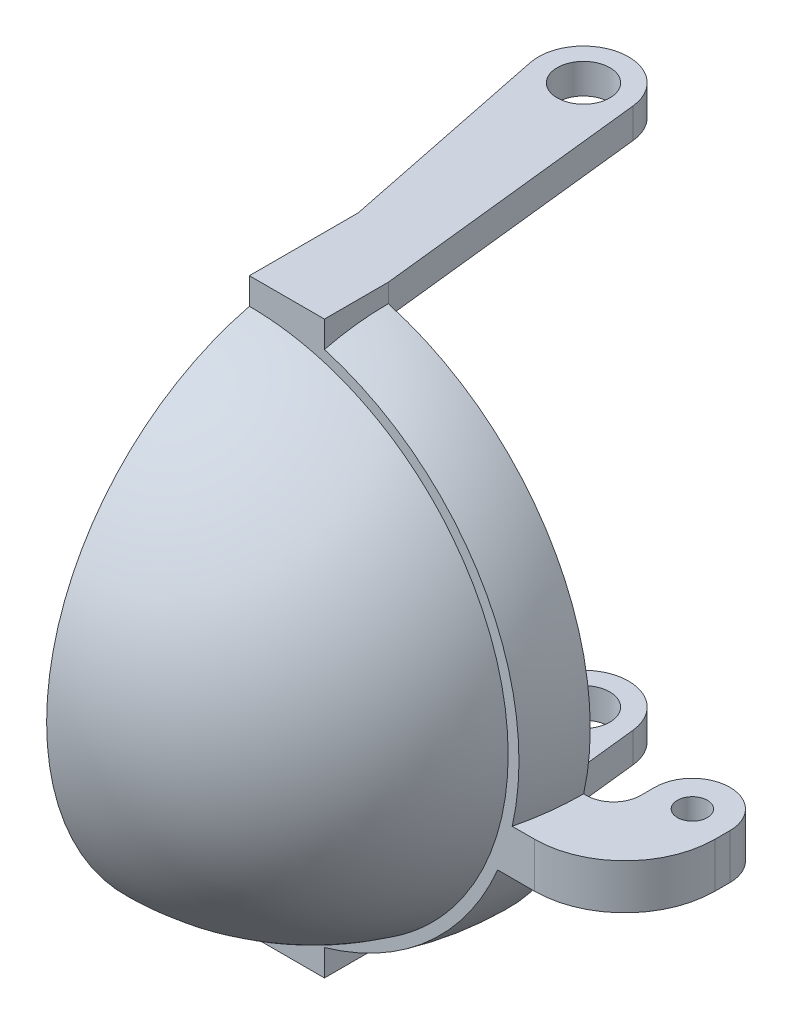
ISO-10303-21;
HEADER;
FILE_DESCRIPTION(('STEP AP214'),'2;1');
FILE_NAME('part.step','',(''),(''),'','','');
FILE_SCHEMA(('AUTOMOTIVE_DESIGN { 1 0 10303 214 1 1 1 1 }'));
ENDSEC;
DATA;
#1=APPLICATION_CONTEXT('core data for automotive mechanical design processes');
#2=APPLICATION_PROTOCOL_DEFINITION('international standard','automotive_design',2000,#1);
#3=PRODUCT_CONTEXT('',#1,'mechanical');
#4=PRODUCT('Part','Part','',(#3));
#5=PRODUCT_RELATED_PRODUCT_CATEGORY('part','',(#4));
#6=PRODUCT_DEFINITION_FORMATION('','',#4);
#7=PRODUCT_DEFINITION_CONTEXT('part definition',#1,'design');
#8=PRODUCT_DEFINITION('design','',#6,#7);
#9=PRODUCT_DEFINITION_SHAPE('','',#8);
#10=(LENGTH_UNIT() NAMED_UNIT(*) SI_UNIT(.MILLI.,.METRE.));
#11=(NAMED_UNIT(*) PLANE_ANGLE_UNIT() SI_UNIT($,.RADIAN.));
#12=(NAMED_UNIT(*) SI_UNIT($,.STERADIAN.) SOLID_ANGLE_UNIT());
#13=UNCERTAINTY_MEASURE_WITH_UNIT(LENGTH_MEASURE(1.E-05),#10,'distance_accuracy_value','');
#14=(GEOMETRIC_REPRESENTATION_CONTEXT(3) GLOBAL_UNCERTAINTY_ASSIGNED_CONTEXT((#13)) GLOBAL_UNIT_ASSIGNED_CONTEXT((#10,
#11,#12)) REPRESENTATION_CONTEXT('',''));
#15=CARTESIAN_POINT('',(0.,0.,0.));
#16=DIRECTION('',(0.,0.,1.));
#17=DIRECTION('',(1.,0.,0.));
#18=AXIS2_PLACEMENT_3D('',#15,#16,#17);
#19=CARTESIAN_POINT('',(0.,0.,0.));
#20=DIRECTION('',(0.,0.,-1.));
#21=DIRECTION('',(0.,-1.,0.));
#22=AXIS2_PLACEMENT_3D('',#19,#20,#21);
#23=SPHERICAL_SURFACE('',#22,18.45);
#24=CARTESIAN_POINT('',(0.,0.,4.25));
#25=DIRECTION('',(0.,0.,1.));
#26=DIRECTION('',(1.,0.,0.));
#27=AXIS2_PLACEMENT_3D('',#24,#25,#26);
#28=CIRCLE('',#27,17.9538296750303);
#29=CARTESIAN_POINT('',(5.,-17.2435495185881,4.25));
#30=VERTEX_POINT('',#29);
#31=CARTESIAN_POINT('',(16.5329973084133,-7.,4.25));
#32=VERTEX_POINT('',#31);
#33=EDGE_CURVE('E359',#30,#32,#28,.T.);
#34=ORIENTED_EDGE('',*,*,#33,.F.);
#35=CARTESIAN_POINT('',(5.,0.,0.));
#36=DIRECTION('',(1.,0.,0.));
#37=DIRECTION('',(0.,0.,-1.));
#38=AXIS2_PLACEMENT_3D('',#35,#36,#37);
#39=CIRCLE('',#38,17.7595748822994);
#40=CARTESIAN_POINT('',(5.,-17.7595748822994,0.));
#41=VERTEX_POINT('',#40);
#42=EDGE_CURVE('E339',#41,#30,#39,.F.);
#43=ORIENTED_EDGE('',*,*,#42,.F.);
#44=CARTESIAN_POINT('',(0.,0.,0.));
#45=DIRECTION('',(0.,0.,1.));
#46=DIRECTION('',(1.,0.,0.));
#47=AXIS2_PLACEMENT_3D('',#44,#45,#46);
#48=CIRCLE('',#47,18.45);
#49=CARTESIAN_POINT('',(17.0705155165273,-7.,0.));
#50=VERTEX_POINT('',#49);
#51=EDGE_CURVE('E366',#41,#50,#48,.T.);
#52=ORIENTED_EDGE('',*,*,#51,.T.);
#53=CARTESIAN_POINT('',(0.,-7.,0.));
#54=DIRECTION('',(0.,1.,0.));
#55=DIRECTION('',(0.,0.,1.));
#56=AXIS2_PLACEMENT_3D('',#53,#54,#55);
#57=CIRCLE('',#56,17.0705155165273);
#58=EDGE_CURVE('E235',#50,#32,#57,.F.);
#59=ORIENTED_EDGE('',*,*,#58,.T.);
#60=EDGE_LOOP('',(#34,#43,#52,#59));
#61=FACE_BOUND('',#60,.T.);
#62=ADVANCED_FACE('F45',(#61),#23,.T.);
#63=CARTESIAN_POINT('',(0.,0.,0.));
#64=DIRECTION('',(0.,0.,-1.));
#65=DIRECTION('',(1.,0.,0.));
#66=AXIS2_PLACEMENT_3D('',#63,#64,#65);
#67=PLANE('',#66);
#68=DIRECTION('',(1.,0.,0.));
#69=VECTOR('',#68,1.);
#70=CARTESIAN_POINT('',(-18.451,-7.,0.));
#71=LINE('',#70,#69);
#72=CARTESIAN_POINT('',(18.2,-7.,0.));
#73=VERTEX_POINT('',#72);
#74=EDGE_CURVE('E230',#50,#73,#71,.T.);
#75=ORIENTED_EDGE('',*,*,#74,.F.);
#76=ORIENTED_EDGE('',*,*,#51,.F.);
#77=DIRECTION('',(0.,-1.,0.));
#78=VECTOR('',#77,1.);
#79=CARTESIAN_POINT('',(5.,-17.,0.));
#80=LINE('',#79,#78);
#81=CARTESIAN_POINT('',(5.,-17.,0.));
#82=VERTEX_POINT('',#81);
#83=EDGE_CURVE('E330',#82,#41,#80,.T.);
#84=ORIENTED_EDGE('',*,*,#83,.F.);
#85=DIRECTION('',(1.,0.,0.));
#86=VECTOR('',#85,1.);
#87=CARTESIAN_POINT('',(5.,-17.,0.));
#88=LINE('',#87,#86);
#89=CARTESIAN_POINT('',(0.,-17.,0.));
#90=VERTEX_POINT('',#89);
#91=EDGE_CURVE('E315',#90,#82,#88,.T.);
#92=ORIENTED_EDGE('',*,*,#91,.F.);
#93=CARTESIAN_POINT('',(0.,0.,0.));
#94=DIRECTION('',(0.,0.,-1.));
#95=DIRECTION('',(1.,0.,0.));
#96=AXIS2_PLACEMENT_3D('',#93,#94,#95);
#97=CIRCLE('',#96,17.);
#98=CARTESIAN_POINT('',(0.,17.,0.));
#99=VERTEX_POINT('',#98);
#100=EDGE_CURVE('E375',#99,#90,#97,.T.);
#101=ORIENTED_EDGE('',*,*,#100,.F.);
#102=DIRECTION('',(1.,0.,0.));
#103=VECTOR('',#102,1.);
#104=CARTESIAN_POINT('',(5.,17.,0.));
#105=LINE('',#104,#103);
#106=CARTESIAN_POINT('',(5.,17.,0.));
#107=VERTEX_POINT('',#106);
#108=EDGE_CURVE('E262',#99,#107,#105,.T.);
#109=ORIENTED_EDGE('',*,*,#108,.T.);
#110=DIRECTION('',(0.,1.,0.));
#111=VECTOR('',#110,1.);
#112=CARTESIAN_POINT('',(5.,17.,0.));
#113=LINE('',#112,#111);
#114=CARTESIAN_POINT('',(5.,17.7595748822994,0.));
#115=VERTEX_POINT('',#114);
#116=EDGE_CURVE('E282',#107,#115,#113,.T.);
#117=ORIENTED_EDGE('',*,*,#116,.T.);
#118=CARTESIAN_POINT('',(18.0111770853545,-4.,0.));
#119=VERTEX_POINT('',#118);
#120=EDGE_CURVE('E365',#119,#115,#48,.T.);
#121=ORIENTED_EDGE('',*,*,#120,.F.);
#122=DIRECTION('',(1.,0.,0.));
#123=VECTOR('',#122,1.);
#124=CARTESIAN_POINT('',(-18.451,-4.,0.));
#125=LINE('',#124,#123);
#126=CARTESIAN_POINT('',(18.2,-4.,0.));
#127=VERTEX_POINT('',#126);
#128=EDGE_CURVE('E236',#119,#127,#125,.T.);
#129=ORIENTED_EDGE('',*,*,#128,.T.);
#130=DIRECTION('',(0.,-1.,0.));
#131=VECTOR('',#130,1.);
#132=CARTESIAN_POINT('',(18.2,0.,0.));
#133=LINE('',#132,#131);
#134=EDGE_CURVE('E389',#73,#127,#133,.F.);
#135=ORIENTED_EDGE('',*,*,#134,.F.);
#136=EDGE_LOOP('',(#75,#76,#84,#92,#101,#109,#117,#121,#129,#135));
#137=FACE_BOUND('',#136,.T.);
#138=ADVANCED_FACE('F392',(#137),#67,.T.);
#139=ORIENTED_EDGE('',*,*,#120,.T.);
#140=CARTESIAN_POINT('',(5.,0.,0.));
#141=DIRECTION('',(-1.,0.,0.));
#142=DIRECTION('',(0.,0.,1.));
#143=AXIS2_PLACEMENT_3D('',#140,#141,#142);
#144=CIRCLE('',#143,17.7595748822994);
#145=CARTESIAN_POINT('',(5.,17.2435495185881,4.25));
#146=VERTEX_POINT('',#145);
#147=EDGE_CURVE('E286',#115,#146,#144,.F.);
#148=ORIENTED_EDGE('',*,*,#147,.T.);
#149=CARTESIAN_POINT('',(17.5025712396779,-4.,4.25));
#150=VERTEX_POINT('',#149);
#151=EDGE_CURVE('E358',#150,#146,#28,.T.);
#152=ORIENTED_EDGE('',*,*,#151,.F.);
#153=CARTESIAN_POINT('',(0.,-4.,0.));
#154=DIRECTION('',(0.,-1.,0.));
#155=DIRECTION('',(0.,0.,-1.));
#156=AXIS2_PLACEMENT_3D('',#153,#154,#155);
#157=CIRCLE('',#156,18.0111770853545);
#158=EDGE_CURVE('E232',#150,#119,#157,.F.);
#159=ORIENTED_EDGE('',*,*,#158,.T.);
#160=EDGE_LOOP('',(#139,#148,#152,#159));
#161=FACE_BOUND('',#160,.T.);
#162=ADVANCED_FACE('F398',(#161),#23,.T.);
#163=CARTESIAN_POINT('',(0.,0.,0.));
#164=DIRECTION('',(0.,1.,0.));
#165=DIRECTION('',(-1.,0.,0.));
#166=AXIS2_PLACEMENT_3D('',#163,#164,#165);
#167=SPHERICAL_SURFACE('',#166,17.75);
#168=CARTESIAN_POINT('',(0.,0.,4.25));
#169=DIRECTION('',(0.,0.,1.));
#170=DIRECTION('',(1.,0.,0.));
#171=AXIS2_PLACEMENT_3D('',#168,#169,#170);
#172=CIRCLE('',#171,17.2336879396141);
#173=CARTESIAN_POINT('',(-1.20342199681217E-13,-17.2336879396141,4.25));
#174=VERTEX_POINT('',#173);
#175=CARTESIAN_POINT('',(0.,17.2336879396141,4.25));
#176=VERTEX_POINT('',#175);
#177=EDGE_CURVE('E362',#174,#176,#172,.T.);
#178=ORIENTED_EDGE('',*,*,#177,.T.);
#179=CARTESIAN_POINT('',(0.,0.,0.));
#180=DIRECTION('',(-1.,0.,0.));
#181=DIRECTION('',(0.,0.,1.));
#182=AXIS2_PLACEMENT_3D('',#179,#180,#181);
#183=CIRCLE('',#182,17.75);
#184=EDGE_CURVE('E372',#174,#176,#183,.T.);
#185=ORIENTED_EDGE('',*,*,#184,.F.);
#186=EDGE_LOOP('',(#178,#185));
#187=FACE_BOUND('',#186,.T.);
#188=ADVANCED_FACE('F459',(#187),#167,.T.);
#189=CARTESIAN_POINT('',(0.,0.,0.));
#190=DIRECTION('',(0.,1.,0.));
#191=DIRECTION('',(1.,0.,0.));
#192=AXIS2_PLACEMENT_3D('',#189,#190,#191);
#193=SPHERICAL_SURFACE('',#192,17.);
#194=CARTESIAN_POINT('',(0.,0.,0.));
#195=DIRECTION('',(1.,0.,0.));
#196=DIRECTION('',(0.,0.,1.));
#197=AXIS2_PLACEMENT_3D('',#194,#195,#196);
#198=CIRCLE('',#197,17.);
#199=EDGE_CURVE('E369',#99,#90,#198,.T.);
#200=ORIENTED_EDGE('',*,*,#199,.F.);
#201=ORIENTED_EDGE('',*,*,#100,.T.);
#202=EDGE_LOOP('',(#200,#201));
#203=FACE_BOUND('',#202,.T.);
#204=ADVANCED_FACE('F433',(#203),#193,.F.);
#205=CARTESIAN_POINT('',(0.,0.,0.));
#206=DIRECTION('',(1.,0.,0.));
#207=DIRECTION('',(0.,0.,1.));
#208=AXIS2_PLACEMENT_3D('',#205,#206,#207);
#209=PLANE('',#208);
#210=ORIENTED_EDGE('',*,*,#199,.T.);
#211=DIRECTION('',(0.,0.,1.));
#212=VECTOR('',#211,1.);
#213=CARTESIAN_POINT('',(0.,-17.,0.));
#214=LINE('',#213,#212);
#215=CARTESIAN_POINT('',(0.,-17.,-3.));
#216=VERTEX_POINT('',#215);
#217=EDGE_CURVE('E313',#216,#90,#214,.T.);
#218=ORIENTED_EDGE('',*,*,#217,.F.);
#219=DIRECTION('',(0.,-1.,0.));
#220=VECTOR('',#219,1.);
#221=CARTESIAN_POINT('',(0.,-17.,-3.));
#222=LINE('',#221,#220);
#223=CARTESIAN_POINT('',(0.,-19.,-3.));
#224=VERTEX_POINT('',#223);
#225=EDGE_CURVE('E333',#216,#224,#222,.T.);
#226=ORIENTED_EDGE('',*,*,#225,.T.);
#227=DIRECTION('',(0.,0.,-1.));
#228=VECTOR('',#227,1.);
#229=CARTESIAN_POINT('',(0.,-19.,0.));
#230=LINE('',#229,#228);
#231=CARTESIAN_POINT('',(0.,-19.,4.25));
#232=VERTEX_POINT('',#231);
#233=EDGE_CURVE('E329',#232,#224,#230,.T.);
#234=ORIENTED_EDGE('',*,*,#233,.F.);
#235=DIRECTION('',(0.,-1.,0.));
#236=VECTOR('',#235,1.);
#237=CARTESIAN_POINT('',(-1.25370922542273E-13,-17.9538296750303,4.25));
#238=LINE('',#237,#236);
#239=EDGE_CURVE('E355',#174,#232,#238,.T.);
#240=ORIENTED_EDGE('',*,*,#239,.F.);
#241=ORIENTED_EDGE('',*,*,#184,.T.);
#242=DIRECTION('',(0.,1.,0.));
#243=VECTOR('',#242,1.);
#244=CARTESIAN_POINT('',(0.,17.9538296750303,4.25));
#245=LINE('',#244,#243);
#246=CARTESIAN_POINT('',(0.,19.,4.25));
#247=VERTEX_POINT('',#246);
#248=EDGE_CURVE('E348',#176,#247,#245,.T.);
#249=ORIENTED_EDGE('',*,*,#248,.T.);
#250=DIRECTION('',(0.,0.,-1.));
#251=VECTOR('',#250,1.);
#252=CARTESIAN_POINT('',(0.,19.,0.));
#253=LINE('',#252,#251);
#254=CARTESIAN_POINT('',(0.,19.,-3.));
#255=VERTEX_POINT('',#254);
#256=EDGE_CURVE('E278',#247,#255,#253,.T.);
#257=ORIENTED_EDGE('',*,*,#256,.T.);
#258=DIRECTION('',(0.,1.,0.));
#259=VECTOR('',#258,1.);
#260=CARTESIAN_POINT('',(0.,17.,-3.));
#261=LINE('',#260,#259);
#262=CARTESIAN_POINT('',(0.,17.,-3.));
#263=VERTEX_POINT('',#262);
#264=EDGE_CURVE('E279',#263,#255,#261,.T.);
#265=ORIENTED_EDGE('',*,*,#264,.F.);
#266=DIRECTION('',(0.,0.,1.));
#267=VECTOR('',#266,1.);
#268=CARTESIAN_POINT('',(0.,17.,0.));
#269=LINE('',#268,#267);
#270=EDGE_CURVE('E265',#263,#99,#269,.T.);
#271=ORIENTED_EDGE('',*,*,#270,.T.);
#272=EDGE_LOOP('',(#210,#218,#226,#234,#240,#241,#249,#257,#265,#271));
#273=FACE_BOUND('',#272,.T.);
#274=ADVANCED_FACE('F456',(#273),#209,.F.);
#275=CARTESIAN_POINT('',(-1.25370922542273E-13,-17.9538296750303,4.25));
#276=DIRECTION('',(0.,0.,-1.));
#277=DIRECTION('',(1.,0.,0.));
#278=AXIS2_PLACEMENT_3D('',#275,#276,#277);
#279=PLANE('',#278);
#280=DIRECTION('',(1.,0.,0.));
#281=VECTOR('',#280,1.);
#282=CARTESIAN_POINT('',(-18.451,-4.,4.25));
#283=LINE('',#282,#281);
#284=CARTESIAN_POINT('',(19.,-4.,4.25));
#285=VERTEX_POINT('',#284);
#286=EDGE_CURVE('E239',#150,#285,#283,.T.);
#287=ORIENTED_EDGE('',*,*,#286,.F.);
#288=ORIENTED_EDGE('',*,*,#151,.T.);
#289=DIRECTION('',(0.,1.,0.));
#290=VECTOR('',#289,1.);
#291=CARTESIAN_POINT('',(5.,-19.001,4.25));
#292=LINE('',#291,#290);
#293=CARTESIAN_POINT('',(5.,19.,4.25));
#294=VERTEX_POINT('',#293);
#295=EDGE_CURVE('E290',#146,#294,#292,.T.);
#296=ORIENTED_EDGE('',*,*,#295,.T.);
#297=DIRECTION('',(-1.,0.,0.));
#298=VECTOR('',#297,1.);
#299=CARTESIAN_POINT('',(0.,19.,4.25));
#300=LINE('',#299,#298);
#301=EDGE_CURVE('E293',#294,#247,#300,.T.);
#302=ORIENTED_EDGE('',*,*,#301,.T.);
#303=ORIENTED_EDGE('',*,*,#248,.F.);
#304=ORIENTED_EDGE('',*,*,#177,.F.);
#305=ORIENTED_EDGE('',*,*,#239,.T.);
#306=DIRECTION('',(-1.,0.,0.));
#307=VECTOR('',#306,1.);
#308=CARTESIAN_POINT('',(0.,-19.,4.25));
#309=LINE('',#308,#307);
#310=CARTESIAN_POINT('',(5.,-19.,4.25));
#311=VERTEX_POINT('',#310);
#312=EDGE_CURVE('E337',#311,#232,#309,.T.);
#313=ORIENTED_EDGE('',*,*,#312,.F.);
#314=DIRECTION('',(0.,-1.,0.));
#315=VECTOR('',#314,1.);
#316=CARTESIAN_POINT('',(5.,18.451,4.25));
#317=LINE('',#316,#315);
#318=EDGE_CURVE('E340',#30,#311,#317,.T.);
#319=ORIENTED_EDGE('',*,*,#318,.F.);
#320=ORIENTED_EDGE('',*,*,#33,.T.);
#321=DIRECTION('',(1.,0.,0.));
#322=VECTOR('',#321,1.);
#323=CARTESIAN_POINT('',(-18.451,-7.,4.25));
#324=LINE('',#323,#322);
#325=CARTESIAN_POINT('',(19.,-7.,4.25));
#326=VERTEX_POINT('',#325);
#327=EDGE_CURVE('E242',#32,#326,#324,.T.);
#328=ORIENTED_EDGE('',*,*,#327,.T.);
#329=DIRECTION('',(0.,-1.,0.));
#330=VECTOR('',#329,1.);
#331=CARTESIAN_POINT('',(19.,-17.9538296750303,4.25));
#332=LINE('',#331,#330);
#333=EDGE_CURVE('E378',#285,#326,#332,.T.);
#334=ORIENTED_EDGE('',*,*,#333,.F.);
#335=EDGE_LOOP('',(#287,#288,#296,#302,#303,#304,#305,#313,#319,#320,#328,#334));
#336=FACE_BOUND('',#335,.T.);
#337=ADVANCED_FACE('F401',(#336),#279,.F.);
#338=CARTESIAN_POINT('',(5.,18.451,0.));
#339=DIRECTION('',(-1.,0.,0.));
#340=DIRECTION('',(0.,0.,-1.));
#341=AXIS2_PLACEMENT_3D('',#338,#339,#340);
#342=PLANE('',#341);
#343=ORIENTED_EDGE('',*,*,#42,.T.);
#344=ORIENTED_EDGE('',*,*,#318,.T.);
#345=DIRECTION('',(0.,0.,1.));
#346=VECTOR('',#345,1.);
#347=CARTESIAN_POINT('',(5.,-19.,0.));
#348=LINE('',#347,#346);
#349=CARTESIAN_POINT('',(5.,-19.,0.));
#350=VERTEX_POINT('',#349);
#351=EDGE_CURVE('E341',#350,#311,#348,.T.);
#352=ORIENTED_EDGE('',*,*,#351,.F.);
#353=DIRECTION('',(0.,-1.,0.));
#354=VECTOR('',#353,1.);
#355=CARTESIAN_POINT('',(5.,18.451,0.));
#356=LINE('',#355,#354);
#357=EDGE_CURVE('E343',#41,#350,#356,.T.);
#358=ORIENTED_EDGE('',*,*,#357,.F.);
#359=EDGE_LOOP('',(#343,#344,#352,#358));
#360=FACE_BOUND('',#359,.T.);
#361=ADVANCED_FACE('F419',(#360),#342,.F.);
#362=CARTESIAN_POINT('',(0.,-19.,0.));
#363=DIRECTION('',(0.,-1.,0.));
#364=DIRECTION('',(0.,0.,1.));
#365=AXIS2_PLACEMENT_3D('',#362,#363,#364);
#366=PLANE('',#365);
#367=ORIENTED_EDGE('',*,*,#233,.T.);
#368=DIRECTION('',(0.2,0.,0.979795897113271));
#369=VECTOR('',#368,1.);
#370=CARTESIAN_POINT('',(0.,-19.,-3.));
#371=LINE('',#370,#369);
#372=CARTESIAN_POINT('',(-2.93938769133981,-19.,-17.4));
#373=VERTEX_POINT('',#372);
#374=EDGE_CURVE('E323',#373,#224,#371,.T.);
#375=ORIENTED_EDGE('',*,*,#374,.F.);
#376=CARTESIAN_POINT('',(0.,-19.,-18.));
#377=DIRECTION('',(0.,1.,0.));
#378=DIRECTION('',(0.,0.,1.));
#379=AXIS2_PLACEMENT_3D('',#376,#377,#378);
#380=CIRCLE('',#379,3.);
#381=CARTESIAN_POINT('',(2.98197937360353,-19.,-18.3283276037788));
#382=VERTEX_POINT('',#381);
#383=EDGE_CURVE('E304',#382,#373,#380,.T.);
#384=ORIENTED_EDGE('',*,*,#383,.F.);
#385=DIRECTION('',(-0.109442534592919,0.,-0.99399312453451));
#386=VECTOR('',#385,1.);
#387=CARTESIAN_POINT('',(2.98197937360353,-19.,-18.3283276037788));
#388=LINE('',#387,#386);
#389=EDGE_CURVE('E311',#350,#382,#388,.T.);
#390=ORIENTED_EDGE('',*,*,#389,.F.);
#391=ORIENTED_EDGE('',*,*,#351,.T.);
#392=ORIENTED_EDGE('',*,*,#312,.T.);
#393=EDGE_LOOP('',(#367,#375,#384,#390,#391,#392));
#394=FACE_BOUND('',#393,.T.);
#395=CARTESIAN_POINT('',(0.,-19.,-18.));
#396=DIRECTION('',(0.,1.,0.));
#397=DIRECTION('',(0.,0.,1.));
#398=AXIS2_PLACEMENT_3D('',#395,#396,#397);
#399=CIRCLE('',#398,1.75);
#400=CARTESIAN_POINT('',(0.,-19.,-16.25));
#401=VERTEX_POINT('',#400);
#402=EDGE_CURVE('E289',#401,#401,#399,.T.);
#403=ORIENTED_EDGE('',*,*,#402,.T.);
#404=EDGE_LOOP('',(#403));
#405=FACE_BOUND('',#404,.T.);
#406=ADVANCED_FACE('F496',(#394,#405),#366,.T.);
#407=CARTESIAN_POINT('',(0.,-17.,-18.));
#408=DIRECTION('',(0.,-1.,0.));
#409=DIRECTION('',(0.,0.,1.));
#410=AXIS2_PLACEMENT_3D('',#407,#408,#409);
#411=CYLINDRICAL_SURFACE('',#410,3.);
#412=ORIENTED_EDGE('',*,*,#383,.T.);
#413=DIRECTION('',(0.,-1.,0.));
#414=VECTOR('',#413,1.);
#415=CARTESIAN_POINT('',(-2.93938769133981,-17.,-17.4));
#416=LINE('',#415,#414);
#417=CARTESIAN_POINT('',(-2.93938769133981,-17.,-17.4));
#418=VERTEX_POINT('',#417);
#419=EDGE_CURVE('E320',#418,#373,#416,.T.);
#420=ORIENTED_EDGE('',*,*,#419,.F.);
#421=CARTESIAN_POINT('',(0.,-17.,-18.));
#422=DIRECTION('',(0.,1.,0.));
#423=DIRECTION('',(0.,0.,1.));
#424=AXIS2_PLACEMENT_3D('',#421,#422,#423);
#425=CIRCLE('',#424,3.);
#426=CARTESIAN_POINT('',(2.98197937360353,-17.,-18.3283276037788));
#427=VERTEX_POINT('',#426);
#428=EDGE_CURVE('E307',#427,#418,#425,.T.);
#429=ORIENTED_EDGE('',*,*,#428,.F.);
#430=DIRECTION('',(0.,-1.,0.));
#431=VECTOR('',#430,1.);
#432=CARTESIAN_POINT('',(2.98197937360353,-17.,-18.3283276037788));
#433=LINE('',#432,#431);
#434=EDGE_CURVE('E327',#427,#382,#433,.T.);
#435=ORIENTED_EDGE('',*,*,#434,.T.);
#436=EDGE_LOOP('',(#412,#420,#429,#435));
#437=FACE_BOUND('',#436,.T.);
#438=ADVANCED_FACE('F504',(#437),#411,.T.);
#439=CARTESIAN_POINT('',(2.98197937360353,-17.,-18.3283276037788));
#440=DIRECTION('',(0.99399312453451,0.,-0.109442534592919));
#441=DIRECTION('',(0.109442534592919,0.,0.99399312453451));
#442=AXIS2_PLACEMENT_3D('',#439,#440,#441);
#443=PLANE('',#442);
#444=ORIENTED_EDGE('',*,*,#389,.T.);
#445=ORIENTED_EDGE('',*,*,#434,.F.);
#446=DIRECTION('',(-0.109442534592919,0.,-0.99399312453451));
#447=VECTOR('',#446,1.);
#448=CARTESIAN_POINT('',(2.98197937360353,-17.,-18.3283276037788));
#449=LINE('',#448,#447);
#450=EDGE_CURVE('E318',#82,#427,#449,.T.);
#451=ORIENTED_EDGE('',*,*,#450,.F.);
#452=ORIENTED_EDGE('',*,*,#83,.T.);
#453=ORIENTED_EDGE('',*,*,#357,.T.);
#454=EDGE_LOOP('',(#444,#445,#451,#452,#453));
#455=FACE_BOUND('',#454,.T.);
#456=ADVANCED_FACE('F423',(#455),#443,.T.);
#457=CARTESIAN_POINT('',(0.,-17.,-3.));
#458=DIRECTION('',(-0.979795897113271,0.,0.2));
#459=DIRECTION('',(-0.2,0.,-0.979795897113271));
#460=AXIS2_PLACEMENT_3D('',#457,#458,#459);
#461=PLANE('',#460);
#462=ORIENTED_EDGE('',*,*,#374,.T.);
#463=ORIENTED_EDGE('',*,*,#225,.F.);
#464=DIRECTION('',(0.2,0.,0.979795897113271));
#465=VECTOR('',#464,1.);
#466=CARTESIAN_POINT('',(0.,-17.,-3.));
#467=LINE('',#466,#465);
#468=EDGE_CURVE('E310',#418,#216,#467,.T.);
#469=ORIENTED_EDGE('',*,*,#468,.F.);
#470=ORIENTED_EDGE('',*,*,#419,.T.);
#471=EDGE_LOOP('',(#462,#463,#469,#470));
#472=FACE_BOUND('',#471,.T.);
#473=ADVANCED_FACE('F519',(#472),#461,.T.);
#474=CARTESIAN_POINT('',(0.,-17.,-18.));
#475=DIRECTION('',(0.,-1.,0.));
#476=DIRECTION('',(0.,0.,1.));
#477=AXIS2_PLACEMENT_3D('',#474,#475,#476);
#478=PLANE('',#477);
#479=CARTESIAN_POINT('',(0.,-17.,-18.));
#480=DIRECTION('',(0.,1.,0.));
#481=DIRECTION('',(0.,0.,1.));
#482=AXIS2_PLACEMENT_3D('',#479,#480,#481);
#483=CIRCLE('',#482,1.75);
#484=CARTESIAN_POINT('',(0.,-17.,-16.25));
#485=VERTEX_POINT('',#484);
#486=EDGE_CURVE('E301',#485,#485,#483,.T.);
#487=ORIENTED_EDGE('',*,*,#486,.F.);
#488=EDGE_LOOP('',(#487));
#489=FACE_BOUND('',#488,.T.);
#490=ORIENTED_EDGE('',*,*,#428,.T.);
#491=ORIENTED_EDGE('',*,*,#468,.T.);
#492=ORIENTED_EDGE('',*,*,#217,.T.);
#493=ORIENTED_EDGE('',*,*,#91,.T.);
#494=ORIENTED_EDGE('',*,*,#450,.T.);
#495=EDGE_LOOP('',(#490,#491,#492,#493,#494));
#496=FACE_BOUND('',#495,.T.);
#497=ADVANCED_FACE('F427',(#489,#496),#478,.F.);
#498=CARTESIAN_POINT('',(0.,-17.,-18.));
#499=DIRECTION('',(0.,-1.,0.));
#500=DIRECTION('',(0.,0.,1.));
#501=AXIS2_PLACEMENT_3D('',#498,#499,#500);
#502=CYLINDRICAL_SURFACE('',#501,1.75);
#503=ORIENTED_EDGE('',*,*,#486,.T.);
#504=EDGE_LOOP('',(#503));
#505=FACE_BOUND('',#504,.T.);
#506=ORIENTED_EDGE('',*,*,#402,.F.);
#507=EDGE_LOOP('',(#506));
#508=FACE_BOUND('',#507,.T.);
#509=ADVANCED_FACE('F535',(#505,#508),#502,.F.);
#510=CARTESIAN_POINT('',(0.,19.,0.));
#511=DIRECTION('',(0.,1.,0.));
#512=DIRECTION('',(0.,0.,1.));
#513=AXIS2_PLACEMENT_3D('',#510,#511,#512);
#514=PLANE('',#513);
#515=ORIENTED_EDGE('',*,*,#256,.F.);
#516=ORIENTED_EDGE('',*,*,#301,.F.);
#517=DIRECTION('',(0.,0.,1.));
#518=VECTOR('',#517,1.);
#519=CARTESIAN_POINT('',(5.,19.,0.));
#520=LINE('',#519,#518);
#521=CARTESIAN_POINT('',(5.,19.,0.));
#522=VERTEX_POINT('',#521);
#523=EDGE_CURVE('E295',#522,#294,#520,.T.);
#524=ORIENTED_EDGE('',*,*,#523,.F.);
#525=DIRECTION('',(-0.109442534592919,0.,-0.99399312453451));
#526=VECTOR('',#525,1.);
#527=CARTESIAN_POINT('',(2.98197937360353,19.,-18.3283276037788));
#528=LINE('',#527,#526);
#529=CARTESIAN_POINT('',(2.98197937360353,19.,-18.3283276037788));
#530=VERTEX_POINT('',#529);
#531=EDGE_CURVE('E272',#522,#530,#528,.T.);
#532=ORIENTED_EDGE('',*,*,#531,.T.);
#533=CARTESIAN_POINT('',(0.,19.,-18.));
#534=DIRECTION('',(0.,1.,0.));
#535=DIRECTION('',(0.,0.,1.));
#536=AXIS2_PLACEMENT_3D('',#533,#534,#535);
#537=CIRCLE('',#536,3.);
#538=CARTESIAN_POINT('',(-2.93938769133981,19.,-17.4));
#539=VERTEX_POINT('',#538);
#540=EDGE_CURVE('E252',#530,#539,#537,.T.);
#541=ORIENTED_EDGE('',*,*,#540,.T.);
#542=DIRECTION('',(0.2,0.,0.979795897113271));
#543=VECTOR('',#542,1.);
#544=CARTESIAN_POINT('',(0.,19.,-3.));
#545=LINE('',#544,#543);
#546=EDGE_CURVE('E259',#539,#255,#545,.T.);
#547=ORIENTED_EDGE('',*,*,#546,.T.);
#548=EDGE_LOOP('',(#515,#516,#524,#532,#541,#547));
#549=FACE_BOUND('',#548,.T.);
#550=CARTESIAN_POINT('',(0.,19.,-18.));
#551=DIRECTION('',(0.,1.,0.));
#552=DIRECTION('',(0.,0.,1.));
#553=AXIS2_PLACEMENT_3D('',#550,#551,#552);
#554=CIRCLE('',#553,1.75);
#555=CARTESIAN_POINT('',(0.,19.,-16.25));
#556=VERTEX_POINT('',#555);
#557=EDGE_CURVE('E234',#556,#556,#554,.T.);
#558=ORIENTED_EDGE('',*,*,#557,.F.);
#559=EDGE_LOOP('',(#558));
#560=FACE_BOUND('',#559,.T.);
#561=ADVANCED_FACE('F452',(#549,#560),#514,.T.);
#562=CARTESIAN_POINT('',(5.,-19.001,0.));
#563=DIRECTION('',(1.,0.,0.));
#564=DIRECTION('',(0.,0.,1.));
#565=AXIS2_PLACEMENT_3D('',#562,#563,#564);
#566=PLANE('',#565);
#567=DIRECTION('',(0.,1.,0.));
#568=VECTOR('',#567,1.);
#569=CARTESIAN_POINT('',(5.,-19.001,0.));
#570=LINE('',#569,#568);
#571=EDGE_CURVE('E297',#115,#522,#570,.T.);
#572=ORIENTED_EDGE('',*,*,#571,.T.);
#573=ORIENTED_EDGE('',*,*,#523,.T.);
#574=ORIENTED_EDGE('',*,*,#295,.F.);
#575=ORIENTED_EDGE('',*,*,#147,.F.);
#576=EDGE_LOOP('',(#572,#573,#574,#575));
#577=FACE_BOUND('',#576,.T.);
#578=ADVANCED_FACE('F448',(#577),#566,.T.);
#579=CARTESIAN_POINT('',(0.,17.,-18.));
#580=DIRECTION('',(0.,1.,0.));
#581=DIRECTION('',(0.,0.,1.));
#582=AXIS2_PLACEMENT_3D('',#579,#580,#581);
#583=PLANE('',#582);
#584=CARTESIAN_POINT('',(0.,17.,-18.));
#585=DIRECTION('',(0.,1.,0.));
#586=DIRECTION('',(0.,0.,1.));
#587=AXIS2_PLACEMENT_3D('',#584,#585,#586);
#588=CIRCLE('',#587,3.);
#589=CARTESIAN_POINT('',(2.98197937360353,17.,-18.3283276037788));
#590=VERTEX_POINT('',#589);
#591=CARTESIAN_POINT('',(-2.93938769133981,17.,-17.4));
#592=VERTEX_POINT('',#591);
#593=EDGE_CURVE('E255',#590,#592,#588,.T.);
#594=ORIENTED_EDGE('',*,*,#593,.F.);
#595=DIRECTION('',(-0.109442534592919,0.,-0.99399312453451));
#596=VECTOR('',#595,1.);
#597=CARTESIAN_POINT('',(2.98197937360353,17.,-18.3283276037788));
#598=LINE('',#597,#596);
#599=EDGE_CURVE('E258',#107,#590,#598,.T.);
#600=ORIENTED_EDGE('',*,*,#599,.F.);
#601=ORIENTED_EDGE('',*,*,#108,.F.);
#602=ORIENTED_EDGE('',*,*,#270,.F.);
#603=DIRECTION('',(0.2,0.,0.979795897113271));
#604=VECTOR('',#603,1.);
#605=CARTESIAN_POINT('',(0.,17.,-3.));
#606=LINE('',#605,#604);
#607=EDGE_CURVE('E267',#592,#263,#606,.T.);
#608=ORIENTED_EDGE('',*,*,#607,.F.);
#609=EDGE_LOOP('',(#594,#600,#601,#602,#608));
#610=FACE_BOUND('',#609,.T.);
#611=CARTESIAN_POINT('',(0.,17.,-18.));
#612=DIRECTION('',(0.,1.,0.));
#613=DIRECTION('',(0.,0.,1.));
#614=AXIS2_PLACEMENT_3D('',#611,#612,#613);
#615=CIRCLE('',#614,1.75);
#616=CARTESIAN_POINT('',(0.,17.,-16.25));
#617=VERTEX_POINT('',#616);
#618=EDGE_CURVE('E249',#617,#617,#615,.T.);
#619=ORIENTED_EDGE('',*,*,#618,.T.);
#620=EDGE_LOOP('',(#619));
#621=FACE_BOUND('',#620,.T.);
#622=ADVANCED_FACE('F438',(#610,#621),#583,.F.);
#623=CARTESIAN_POINT('',(0.,17.,-18.));
#624=DIRECTION('',(0.,1.,0.));
#625=DIRECTION('',(0.,0.,-1.));
#626=AXIS2_PLACEMENT_3D('',#623,#624,#625);
#627=CYLINDRICAL_SURFACE('',#626,3.);
#628=ORIENTED_EDGE('',*,*,#540,.F.);
#629=DIRECTION('',(0.,1.,0.));
#630=VECTOR('',#629,1.);
#631=CARTESIAN_POINT('',(2.98197937360353,17.,-18.3283276037788));
#632=LINE('',#631,#630);
#633=EDGE_CURVE('E269',#590,#530,#632,.T.);
#634=ORIENTED_EDGE('',*,*,#633,.F.);
#635=ORIENTED_EDGE('',*,*,#593,.T.);
#636=DIRECTION('',(0.,1.,0.));
#637=VECTOR('',#636,1.);
#638=CARTESIAN_POINT('',(-2.93938769133981,17.,-17.4));
#639=LINE('',#638,#637);
#640=EDGE_CURVE('E276',#592,#539,#639,.T.);
#641=ORIENTED_EDGE('',*,*,#640,.T.);
#642=EDGE_LOOP('',(#628,#634,#635,#641));
#643=FACE_BOUND('',#642,.T.);
#644=ADVANCED_FACE('F566',(#643),#627,.T.);
#645=CARTESIAN_POINT('',(0.,17.,-3.));
#646=DIRECTION('',(0.979795897113271,0.,-0.2));
#647=DIRECTION('',(0.2,0.,0.979795897113271));
#648=AXIS2_PLACEMENT_3D('',#645,#646,#647);
#649=PLANE('',#648);
#650=ORIENTED_EDGE('',*,*,#546,.F.);
#651=ORIENTED_EDGE('',*,*,#640,.F.);
#652=ORIENTED_EDGE('',*,*,#607,.T.);
#653=ORIENTED_EDGE('',*,*,#264,.T.);
#654=EDGE_LOOP('',(#650,#651,#652,#653));
#655=FACE_BOUND('',#654,.T.);
#656=ADVANCED_FACE('F574',(#655),#649,.F.);
#657=CARTESIAN_POINT('',(2.98197937360353,17.,-18.3283276037788));
#658=DIRECTION('',(-0.99399312453451,0.,0.109442534592919));
#659=DIRECTION('',(-0.109442534592919,0.,-0.99399312453451));
#660=AXIS2_PLACEMENT_3D('',#657,#658,#659);
#661=PLANE('',#660);
#662=ORIENTED_EDGE('',*,*,#531,.F.);
#663=ORIENTED_EDGE('',*,*,#571,.F.);
#664=ORIENTED_EDGE('',*,*,#116,.F.);
#665=ORIENTED_EDGE('',*,*,#599,.T.);
#666=ORIENTED_EDGE('',*,*,#633,.T.);
#667=EDGE_LOOP('',(#662,#663,#664,#665,#666));
#668=FACE_BOUND('',#667,.T.);
#669=ADVANCED_FACE('F445',(#668),#661,.F.);
#670=CARTESIAN_POINT('',(0.,17.,-18.));
#671=DIRECTION('',(0.,1.,0.));
#672=DIRECTION('',(0.,0.,-1.));
#673=AXIS2_PLACEMENT_3D('',#670,#671,#672);
#674=CYLINDRICAL_SURFACE('',#673,1.75);
#675=ORIENTED_EDGE('',*,*,#618,.F.);
#676=EDGE_LOOP('',(#675));
#677=FACE_BOUND('',#676,.T.);
#678=ORIENTED_EDGE('',*,*,#557,.T.);
#679=EDGE_LOOP('',(#678));
#680=FACE_BOUND('',#679,.T.);
#681=ADVANCED_FACE('F591',(#677,#680),#674,.F.);
#682=CARTESIAN_POINT('',(-18.451,-7.,0.));
#683=DIRECTION('',(0.,-1.,0.));
#684=DIRECTION('',(0.,0.,1.));
#685=AXIS2_PLACEMENT_3D('',#682,#683,#684);
#686=PLANE('',#685);
#687=ORIENTED_EDGE('',*,*,#327,.F.);
#688=ORIENTED_EDGE('',*,*,#58,.F.);
#689=ORIENTED_EDGE('',*,*,#74,.T.);
#690=CARTESIAN_POINT('',(18.2,-7.,-1.80000000000005));
#691=DIRECTION('',(0.,1.,0.));
#692=DIRECTION('',(0.,0.,1.));
#693=AXIS2_PLACEMENT_3D('',#690,#691,#692);
#694=CIRCLE('',#693,1.8);
#695=CARTESIAN_POINT('',(20.,-7.,-1.80000000000005));
#696=VERTEX_POINT('',#695);
#697=EDGE_CURVE('E53',#696,#73,#694,.F.);
#698=ORIENTED_EDGE('',*,*,#697,.F.);
#699=DIRECTION('',(0.,0.,-1.));
#700=VECTOR('',#699,1.);
#701=CARTESIAN_POINT('',(20.,-7.,0.));
#702=LINE('',#701,#700);
#703=CARTESIAN_POINT('',(20.,-7.,-2.75));
#704=VERTEX_POINT('',#703);
#705=EDGE_CURVE('E226',#696,#704,#702,.T.);
#706=ORIENTED_EDGE('',*,*,#705,.T.);
#707=CARTESIAN_POINT('',(22.5,-7.,-2.75));
#708=DIRECTION('',(0.,1.,0.));
#709=DIRECTION('',(0.,0.,1.));
#710=AXIS2_PLACEMENT_3D('',#707,#708,#709);
#711=CIRCLE('',#710,2.5);
#712=CARTESIAN_POINT('',(25.,-7.,-2.75));
#713=VERTEX_POINT('',#712);
#714=EDGE_CURVE('E200',#704,#713,#711,.F.);
#715=ORIENTED_EDGE('',*,*,#714,.T.);
#716=DIRECTION('',(0.,0.,1.));
#717=VECTOR('',#716,1.);
#718=CARTESIAN_POINT('',(25.,-7.,0.));
#719=LINE('',#718,#717);
#720=CARTESIAN_POINT('',(25.,-7.,-1.75));
#721=VERTEX_POINT('',#720);
#722=EDGE_CURVE('E218',#713,#721,#719,.T.);
#723=ORIENTED_EDGE('',*,*,#722,.T.);
#724=CARTESIAN_POINT('',(19.,-7.,-1.75));
#725=DIRECTION('',(0.,1.,0.));
#726=DIRECTION('',(0.,0.,1.));
#727=AXIS2_PLACEMENT_3D('',#724,#725,#726);
#728=CIRCLE('',#727,6.);
#729=EDGE_CURVE('E381',#326,#721,#728,.T.);
#730=ORIENTED_EDGE('',*,*,#729,.F.);
#731=EDGE_LOOP('',(#687,#688,#689,#698,#706,#715,#723,#730));
#732=FACE_BOUND('',#731,.T.);
#733=CARTESIAN_POINT('',(22.5,-7.,-2.75));
#734=DIRECTION('',(0.,1.,0.));
#735=DIRECTION('',(0.,0.,1.));
#736=AXIS2_PLACEMENT_3D('',#733,#734,#735);
#737=CIRCLE('',#736,1.);
#738=CARTESIAN_POINT('',(22.5,-7.,-1.75));
#739=VERTEX_POINT('',#738);
#740=EDGE_CURVE('E222',#739,#739,#737,.T.);
#741=ORIENTED_EDGE('',*,*,#740,.T.);
#742=EDGE_LOOP('',(#741));
#743=FACE_BOUND('',#742,.T.);
#744=ADVANCED_FACE('F409',(#732,#743),#686,.T.);
#745=CARTESIAN_POINT('',(-18.451,-4.,0.));
#746=DIRECTION('',(0.,1.,0.));
#747=DIRECTION('',(0.,0.,-1.));
#748=AXIS2_PLACEMENT_3D('',#745,#746,#747);
#749=PLANE('',#748);
#750=DIRECTION('',(0.,0.,1.));
#751=VECTOR('',#750,1.);
#752=CARTESIAN_POINT('',(25.,-4.,0.));
#753=LINE('',#752,#751);
#754=CARTESIAN_POINT('',(25.,-4.,-2.75));
#755=VERTEX_POINT('',#754);
#756=CARTESIAN_POINT('',(25.,-4.,-1.75));
#757=VERTEX_POINT('',#756);
#758=EDGE_CURVE('E205',#755,#757,#753,.T.);
#759=ORIENTED_EDGE('',*,*,#758,.F.);
#760=CARTESIAN_POINT('',(22.5,-4.,-2.75));
#761=DIRECTION('',(0.,1.,0.));
#762=DIRECTION('',(0.,0.,1.));
#763=AXIS2_PLACEMENT_3D('',#760,#761,#762);
#764=CIRCLE('',#763,2.5);
#765=CARTESIAN_POINT('',(20.,-4.,-2.75));
#766=VERTEX_POINT('',#765);
#767=EDGE_CURVE('E197',#766,#755,#764,.F.);
#768=ORIENTED_EDGE('',*,*,#767,.F.);
#769=DIRECTION('',(0.,0.,-1.));
#770=VECTOR('',#769,1.);
#771=CARTESIAN_POINT('',(20.,-4.,0.));
#772=LINE('',#771,#770);
#773=CARTESIAN_POINT('',(20.,-4.,-1.80000000000005));
#774=VERTEX_POINT('',#773);
#775=EDGE_CURVE('E207',#774,#766,#772,.T.);
#776=ORIENTED_EDGE('',*,*,#775,.F.);
#777=CARTESIAN_POINT('',(18.2,-4.,-1.80000000000005));
#778=DIRECTION('',(0.,-1.,0.));
#779=DIRECTION('',(0.,0.,-1.));
#780=AXIS2_PLACEMENT_3D('',#777,#778,#779);
#781=CIRCLE('',#780,1.8);
#782=EDGE_CURVE('E11',#127,#774,#781,.F.);
#783=ORIENTED_EDGE('',*,*,#782,.F.);
#784=ORIENTED_EDGE('',*,*,#128,.F.);
#785=ORIENTED_EDGE('',*,*,#158,.F.);
#786=ORIENTED_EDGE('',*,*,#286,.T.);
#787=CARTESIAN_POINT('',(19.,-4.,-1.75));
#788=DIRECTION('',(0.,-1.,0.));
#789=DIRECTION('',(0.,0.,-1.));
#790=AXIS2_PLACEMENT_3D('',#787,#788,#789);
#791=CIRCLE('',#790,6.);
#792=EDGE_CURVE('E386',#757,#285,#791,.T.);
#793=ORIENTED_EDGE('',*,*,#792,.F.);
#794=EDGE_LOOP('',(#759,#768,#776,#783,#784,#785,#786,#793));
#795=FACE_BOUND('',#794,.T.);
#796=CARTESIAN_POINT('',(22.5,-4.,-2.75));
#797=DIRECTION('',(0.,1.,0.));
#798=DIRECTION('',(0.,0.,1.));
#799=AXIS2_PLACEMENT_3D('',#796,#797,#798);
#800=CIRCLE('',#799,1.);
#801=CARTESIAN_POINT('',(22.5,-4.,-1.75));
#802=VERTEX_POINT('',#801);
#803=EDGE_CURVE('E215',#802,#802,#800,.T.);
#804=ORIENTED_EDGE('',*,*,#803,.F.);
#805=EDGE_LOOP('',(#804));
#806=FACE_BOUND('',#805,.T.);
#807=ADVANCED_FACE('F211',(#795,#806),#749,.T.);
#808=CARTESIAN_POINT('',(22.5,-4.,-2.75));
#809=DIRECTION('',(0.,-1.,0.));
#810=DIRECTION('',(0.,0.,1.));
#811=AXIS2_PLACEMENT_3D('',#808,#809,#810);
#812=CYLINDRICAL_SURFACE('',#811,2.5);
#813=ORIENTED_EDGE('',*,*,#714,.F.);
#814=DIRECTION('',(0.,-1.,0.));
#815=VECTOR('',#814,1.);
#816=CARTESIAN_POINT('',(20.,-4.,-2.75));
#817=LINE('',#816,#815);
#818=EDGE_CURVE('E193',#766,#704,#817,.T.);
#819=ORIENTED_EDGE('',*,*,#818,.F.);
#820=ORIENTED_EDGE('',*,*,#767,.T.);
#821=DIRECTION('',(0.,-1.,0.));
#822=VECTOR('',#821,1.);
#823=CARTESIAN_POINT('',(25.,-4.,-2.75));
#824=LINE('',#823,#822);
#825=EDGE_CURVE('E204',#755,#713,#824,.T.);
#826=ORIENTED_EDGE('',*,*,#825,.T.);
#827=EDGE_LOOP('',(#813,#819,#820,#826));
#828=FACE_BOUND('',#827,.T.);
#829=ADVANCED_FACE('F195',(#828),#812,.T.);
#830=CARTESIAN_POINT('',(25.,-4.,0.));
#831=DIRECTION('',(-1.,0.,0.));
#832=DIRECTION('',(0.,0.,-1.));
#833=AXIS2_PLACEMENT_3D('',#830,#831,#832);
#834=PLANE('',#833);
#835=ORIENTED_EDGE('',*,*,#722,.F.);
#836=ORIENTED_EDGE('',*,*,#825,.F.);
#837=ORIENTED_EDGE('',*,*,#758,.T.);
#838=DIRECTION('',(0.,-1.,0.));
#839=VECTOR('',#838,1.);
#840=CARTESIAN_POINT('',(25.,-4.,-1.75));
#841=LINE('',#840,#839);
#842=EDGE_CURVE('E384',#721,#757,#841,.F.);
#843=ORIENTED_EDGE('',*,*,#842,.F.);
#844=EDGE_LOOP('',(#835,#836,#837,#843));
#845=FACE_BOUND('',#844,.T.);
#846=ADVANCED_FACE('F407',(#845),#834,.F.);
#847=CARTESIAN_POINT('',(22.5,-4.,-2.75));
#848=DIRECTION('',(0.,-1.,0.));
#849=DIRECTION('',(0.,0.,1.));
#850=AXIS2_PLACEMENT_3D('',#847,#848,#849);
#851=CYLINDRICAL_SURFACE('',#850,1.);
#852=ORIENTED_EDGE('',*,*,#803,.T.);
#853=EDGE_LOOP('',(#852));
#854=FACE_BOUND('',#853,.T.);
#855=ORIENTED_EDGE('',*,*,#740,.F.);
#856=EDGE_LOOP('',(#855));
#857=FACE_BOUND('',#856,.T.);
#858=ADVANCED_FACE('F628',(#854,#857),#851,.F.);
#859=CARTESIAN_POINT('',(20.,-4.,0.));
#860=DIRECTION('',(1.,0.,0.));
#861=DIRECTION('',(0.,0.,1.));
#862=AXIS2_PLACEMENT_3D('',#859,#860,#861);
#863=PLANE('',#862);
#864=ORIENTED_EDGE('',*,*,#775,.T.);
#865=ORIENTED_EDGE('',*,*,#818,.T.);
#866=ORIENTED_EDGE('',*,*,#705,.F.);
#867=DIRECTION('',(0.,-1.,0.));
#868=VECTOR('',#867,1.);
#869=CARTESIAN_POINT('',(20.,-4.,-1.80000000000005));
#870=LINE('',#869,#868);
#871=EDGE_CURVE('E209',#774,#696,#870,.T.);
#872=ORIENTED_EDGE('',*,*,#871,.F.);
#873=EDGE_LOOP('',(#864,#865,#866,#872));
#874=FACE_BOUND('',#873,.T.);
#875=ADVANCED_FACE('F208',(#874),#863,.F.);
#876=CARTESIAN_POINT('',(19.,-17.9538296750303,-1.75));
#877=DIRECTION('',(0.,-1.,0.));
#878=DIRECTION('',(0.,0.,1.));
#879=AXIS2_PLACEMENT_3D('',#876,#877,#878);
#880=CYLINDRICAL_SURFACE('',#879,6.);
#881=ORIENTED_EDGE('',*,*,#792,.T.);
#882=ORIENTED_EDGE('',*,*,#333,.T.);
#883=ORIENTED_EDGE('',*,*,#729,.T.);
#884=ORIENTED_EDGE('',*,*,#842,.T.);
#885=EDGE_LOOP('',(#881,#882,#883,#884));
#886=FACE_BOUND('',#885,.T.);
#887=ADVANCED_FACE('F404',(#886),#880,.T.);
#888=CARTESIAN_POINT('',(18.2,-4.,-1.80000000000005));
#889=DIRECTION('',(0.,-1.,0.));
#890=DIRECTION('',(0.,0.,1.));
#891=AXIS2_PLACEMENT_3D('',#888,#889,#890);
#892=CYLINDRICAL_SURFACE('',#891,1.8);
#893=ORIENTED_EDGE('',*,*,#782,.T.);
#894=ORIENTED_EDGE('',*,*,#871,.T.);
#895=ORIENTED_EDGE('',*,*,#697,.T.);
#896=ORIENTED_EDGE('',*,*,#134,.T.);
#897=EDGE_LOOP('',(#893,#894,#895,#896));
#898=FACE_BOUND('',#897,.T.);
#899=ADVANCED_FACE('F47',(#898),#892,.F.);
#900=CLOSED_SHELL('',(#62,#138,#162,#188,#204,#274,#337,#361,#406,#438,#456,#473,#497,#509,#561,
#578,#622,#644,#656,#669,#681,#744,#807,#829,#846,#858,#875,#887,#899));
#901=MANIFOLD_SOLID_BREP('B2',#900);
#902=ADVANCED_BREP_SHAPE_REPRESENTATION('',(#18,#901),#14);
#903=SHAPE_DEFINITION_REPRESENTATION(#9,#902);
ENDSEC;
END-ISO-10303-21;
